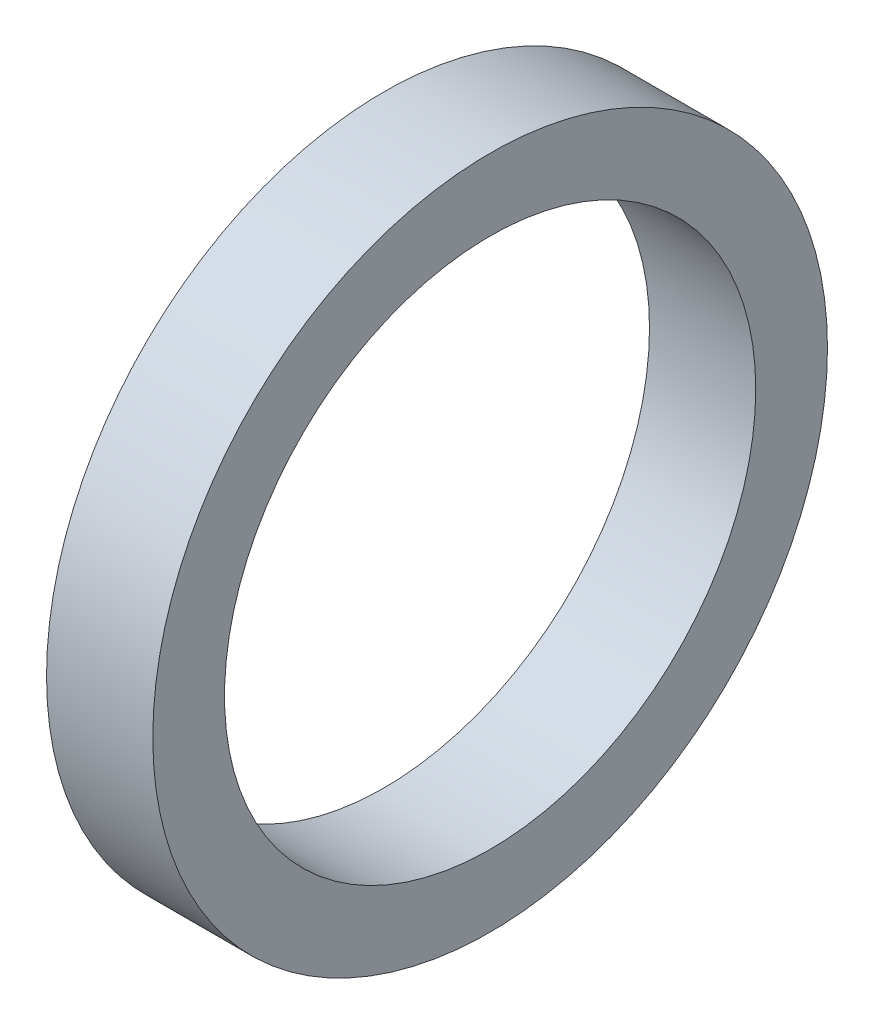
ISO-10303-21;
HEADER;
FILE_DESCRIPTION(('STEP AP214'),'2;1');
FILE_NAME('part.step','',(''),(''),'','','');
FILE_SCHEMA(('AUTOMOTIVE_DESIGN { 1 0 10303 214 1 1 1 1 }'));
ENDSEC;
DATA;
#1=APPLICATION_CONTEXT('core data for automotive mechanical design processes');
#2=APPLICATION_PROTOCOL_DEFINITION('international standard','automotive_design',2000,#1);
#3=PRODUCT_CONTEXT('',#1,'mechanical');
#4=PRODUCT('Part','Part','',(#3));
#5=PRODUCT_RELATED_PRODUCT_CATEGORY('part','',(#4));
#6=PRODUCT_DEFINITION_FORMATION('','',#4);
#7=PRODUCT_DEFINITION_CONTEXT('part definition',#1,'design');
#8=PRODUCT_DEFINITION('design','',#6,#7);
#9=PRODUCT_DEFINITION_SHAPE('','',#8);
#10=(LENGTH_UNIT() NAMED_UNIT(*) SI_UNIT(.MILLI.,.METRE.));
#11=(NAMED_UNIT(*) PLANE_ANGLE_UNIT() SI_UNIT($,.RADIAN.));
#12=(NAMED_UNIT(*) SI_UNIT($,.STERADIAN.) SOLID_ANGLE_UNIT());
#13=UNCERTAINTY_MEASURE_WITH_UNIT(LENGTH_MEASURE(1.E-05),#10,'distance_accuracy_value','');
#14=(GEOMETRIC_REPRESENTATION_CONTEXT(3) GLOBAL_UNCERTAINTY_ASSIGNED_CONTEXT((#13)) GLOBAL_UNIT_ASSIGNED_CONTEXT((#10,
#11,#12)) REPRESENTATION_CONTEXT('',''));
#15=CARTESIAN_POINT('',(0.,0.,0.));
#16=DIRECTION('',(0.,0.,1.));
#17=DIRECTION('',(1.,0.,0.));
#18=AXIS2_PLACEMENT_3D('',#15,#16,#17);
#19=CARTESIAN_POINT('',(6.,0.,0.));
#20=DIRECTION('',(1.,0.,0.));
#21=DIRECTION('',(0.,0.,-1.));
#22=AXIS2_PLACEMENT_3D('',#19,#20,#21);
#23=PLANE('',#22);
#24=CARTESIAN_POINT('',(6.,0.,0.));
#25=DIRECTION('',(1.,0.,0.));
#26=DIRECTION('',(0.,0.,-1.));
#27=AXIS2_PLACEMENT_3D('',#24,#25,#26);
#28=CIRCLE('',#27,19.05);
#29=CARTESIAN_POINT('',(6.,0.,-19.05));
#30=VERTEX_POINT('',#29);
#31=EDGE_CURVE('E10',#30,#30,#28,.T.);
#32=ORIENTED_EDGE('',*,*,#31,.T.);
#33=EDGE_LOOP('',(#32));
#34=FACE_BOUND('',#33,.T.);
#35=CARTESIAN_POINT('',(6.,0.,0.));
#36=DIRECTION('',(1.,0.,0.));
#37=DIRECTION('',(0.,0.,-1.));
#38=AXIS2_PLACEMENT_3D('',#35,#36,#37);
#39=CIRCLE('',#38,15.);
#40=CARTESIAN_POINT('',(6.,0.,-15.));
#41=VERTEX_POINT('',#40);
#42=EDGE_CURVE('E48',#41,#41,#39,.T.);
#43=ORIENTED_EDGE('',*,*,#42,.F.);
#44=EDGE_LOOP('',(#43));
#45=FACE_BOUND('',#44,.T.);
#46=ADVANCED_FACE('F37',(#34,#45),#23,.T.);
#47=CARTESIAN_POINT('',(0.,0.,0.));
#48=DIRECTION('',(1.,0.,0.));
#49=DIRECTION('',(0.,0.,-1.));
#50=AXIS2_PLACEMENT_3D('',#47,#48,#49);
#51=PLANE('',#50);
#52=CARTESIAN_POINT('',(0.,0.,0.));
#53=DIRECTION('',(1.,0.,0.));
#54=DIRECTION('',(0.,0.,-1.));
#55=AXIS2_PLACEMENT_3D('',#52,#53,#54);
#56=CIRCLE('',#55,19.05);
#57=CARTESIAN_POINT('',(0.,0.,-19.05));
#58=VERTEX_POINT('',#57);
#59=EDGE_CURVE('E41',#58,#58,#56,.T.);
#60=ORIENTED_EDGE('',*,*,#59,.F.);
#61=EDGE_LOOP('',(#60));
#62=FACE_BOUND('',#61,.T.);
#63=CARTESIAN_POINT('',(0.,0.,0.));
#64=DIRECTION('',(1.,0.,0.));
#65=DIRECTION('',(0.,0.,-1.));
#66=AXIS2_PLACEMENT_3D('',#63,#64,#65);
#67=CIRCLE('',#66,15.);
#68=CARTESIAN_POINT('',(0.,0.,-15.));
#69=VERTEX_POINT('',#68);
#70=EDGE_CURVE('E50',#69,#69,#67,.T.);
#71=ORIENTED_EDGE('',*,*,#70,.T.);
#72=EDGE_LOOP('',(#71));
#73=FACE_BOUND('',#72,.T.);
#74=ADVANCED_FACE('F60',(#62,#73),#51,.F.);
#75=CARTESIAN_POINT('',(6.,0.,0.));
#76=DIRECTION('',(-1.,0.,0.));
#77=DIRECTION('',(0.,0.,1.));
#78=AXIS2_PLACEMENT_3D('',#75,#76,#77);
#79=CYLINDRICAL_SURFACE('',#78,19.05);
#80=ORIENTED_EDGE('',*,*,#31,.F.);
#81=EDGE_LOOP('',(#80));
#82=FACE_BOUND('',#81,.T.);
#83=ORIENTED_EDGE('',*,*,#59,.T.);
#84=EDGE_LOOP('',(#83));
#85=FACE_BOUND('',#84,.T.);
#86=ADVANCED_FACE('F39',(#82,#85),#79,.T.);
#87=CARTESIAN_POINT('',(6.,0.,0.));
#88=DIRECTION('',(-1.,0.,0.));
#89=DIRECTION('',(0.,0.,1.));
#90=AXIS2_PLACEMENT_3D('',#87,#88,#89);
#91=CYLINDRICAL_SURFACE('',#90,15.);
#92=ORIENTED_EDGE('',*,*,#42,.T.);
#93=EDGE_LOOP('',(#92));
#94=FACE_BOUND('',#93,.T.);
#95=ORIENTED_EDGE('',*,*,#70,.F.);
#96=EDGE_LOOP('',(#95));
#97=FACE_BOUND('',#96,.T.);
#98=ADVANCED_FACE('F56',(#94,#97),#91,.F.);
#99=CLOSED_SHELL('',(#46,#74,#86,#98));
#100=MANIFOLD_SOLID_BREP('B2',#99);
#101=ADVANCED_BREP_SHAPE_REPRESENTATION('',(#18,#100),#14);
#102=SHAPE_DEFINITION_REPRESENTATION(#9,#101);
ENDSEC;
END-ISO-10303-21;
